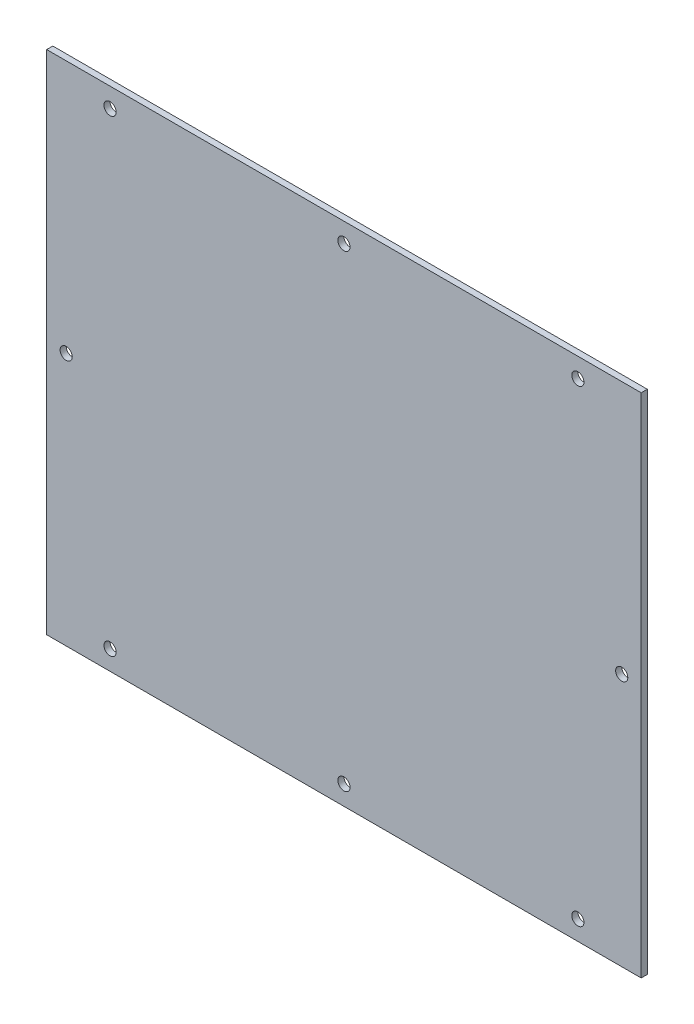
ISO-10303-21;
HEADER;
FILE_DESCRIPTION(('STEP AP214'),'2;1');
FILE_NAME('part.step','',(''),(''),'','','');
FILE_SCHEMA(('AUTOMOTIVE_DESIGN { 1 0 10303 214 1 1 1 1 }'));
ENDSEC;
DATA;
#1=APPLICATION_CONTEXT('core data for automotive mechanical design processes');
#2=APPLICATION_PROTOCOL_DEFINITION('international standard','automotive_design',2000,#1);
#3=PRODUCT_CONTEXT('',#1,'mechanical');
#4=PRODUCT('Part','Part','',(#3));
#5=PRODUCT_RELATED_PRODUCT_CATEGORY('part','',(#4));
#6=PRODUCT_DEFINITION_FORMATION('','',#4);
#7=PRODUCT_DEFINITION_CONTEXT('part definition',#1,'design');
#8=PRODUCT_DEFINITION('design','',#6,#7);
#9=PRODUCT_DEFINITION_SHAPE('','',#8);
#10=(LENGTH_UNIT() NAMED_UNIT(*) SI_UNIT(.MILLI.,.METRE.));
#11=(NAMED_UNIT(*) PLANE_ANGLE_UNIT() SI_UNIT($,.RADIAN.));
#12=(NAMED_UNIT(*) SI_UNIT($,.STERADIAN.) SOLID_ANGLE_UNIT());
#13=UNCERTAINTY_MEASURE_WITH_UNIT(LENGTH_MEASURE(1.E-05),#10,'distance_accuracy_value','');
#14=(GEOMETRIC_REPRESENTATION_CONTEXT(3) GLOBAL_UNCERTAINTY_ASSIGNED_CONTEXT((#13)) GLOBAL_UNIT_ASSIGNED_CONTEXT((#10,
#11,#12)) REPRESENTATION_CONTEXT('',''));
#15=CARTESIAN_POINT('',(0.,0.,0.));
#16=DIRECTION('',(0.,0.,1.));
#17=DIRECTION('',(1.,0.,0.));
#18=AXIS2_PLACEMENT_3D('',#15,#16,#17);
#19=CARTESIAN_POINT('',(0.,0.,3.9878));
#20=DIRECTION('',(0.,0.,-1.));
#21=DIRECTION('',(-1.,0.,0.));
#22=AXIS2_PLACEMENT_3D('',#19,#20,#21);
#23=PLANE('',#22);
#24=DIRECTION('',(0.,1.,0.));
#25=VECTOR('',#24,1.);
#26=CARTESIAN_POINT('',(193.675,-165.1,3.9878));
#27=LINE('',#26,#25);
#28=CARTESIAN_POINT('',(193.675,-165.1,3.9878));
#29=VERTEX_POINT('',#28);
#30=CARTESIAN_POINT('',(193.675,165.1,3.9878));
#31=VERTEX_POINT('',#30);
#32=EDGE_CURVE('E95',#29,#31,#27,.T.);
#33=ORIENTED_EDGE('',*,*,#32,.T.);
#34=DIRECTION('',(-1.,0.,0.));
#35=VECTOR('',#34,1.);
#36=CARTESIAN_POINT('',(-193.675,165.1,3.9878));
#37=LINE('',#36,#35);
#38=CARTESIAN_POINT('',(-193.675,165.1,3.9878));
#39=VERTEX_POINT('',#38);
#40=EDGE_CURVE('E90',#31,#39,#37,.T.);
#41=ORIENTED_EDGE('',*,*,#40,.T.);
#42=DIRECTION('',(0.,-1.,0.));
#43=VECTOR('',#42,1.);
#44=CARTESIAN_POINT('',(-193.675,-165.1,3.9878));
#45=LINE('',#44,#43);
#46=CARTESIAN_POINT('',(-193.675,-165.1,3.9878));
#47=VERTEX_POINT('',#46);
#48=EDGE_CURVE('E93',#39,#47,#45,.T.);
#49=ORIENTED_EDGE('',*,*,#48,.T.);
#50=DIRECTION('',(1.,0.,0.));
#51=VECTOR('',#50,1.);
#52=CARTESIAN_POINT('',(-193.675,-165.1,3.9878));
#53=LINE('',#52,#51);
#54=EDGE_CURVE('E60',#47,#29,#53,.T.);
#55=ORIENTED_EDGE('',*,*,#54,.T.);
#56=EDGE_LOOP('',(#33,#41,#49,#55));
#57=FACE_BOUND('',#56,.T.);
#58=CARTESIAN_POINT('',(-180.975,0.,3.9878));
#59=DIRECTION('',(0.,0.,1.));
#60=DIRECTION('',(1.,0.,0.));
#61=AXIS2_PLACEMENT_3D('',#58,#59,#60);
#62=CIRCLE('',#61,3.96874999999999);
#63=CARTESIAN_POINT('',(-177.00625,0.,3.9878));
#64=VERTEX_POINT('',#63);
#65=EDGE_CURVE('E110',#64,#64,#62,.T.);
#66=ORIENTED_EDGE('',*,*,#65,.F.);
#67=EDGE_LOOP('',(#66));
#68=FACE_BOUND('',#67,.T.);
#69=CARTESIAN_POINT('',(0.,152.4,3.9878));
#70=DIRECTION('',(0.,0.,1.));
#71=DIRECTION('',(1.,0.,0.));
#72=AXIS2_PLACEMENT_3D('',#69,#70,#71);
#73=CIRCLE('',#72,3.96875);
#74=CARTESIAN_POINT('',(3.96875,152.4,3.9878));
#75=VERTEX_POINT('',#74);
#76=EDGE_CURVE('E125',#75,#75,#73,.T.);
#77=ORIENTED_EDGE('',*,*,#76,.F.);
#78=EDGE_LOOP('',(#77));
#79=FACE_BOUND('',#78,.T.);
#80=CARTESIAN_POINT('',(152.4,152.4,3.9878));
#81=DIRECTION('',(0.,0.,1.));
#82=DIRECTION('',(1.,0.,0.));
#83=AXIS2_PLACEMENT_3D('',#80,#81,#82);
#84=CIRCLE('',#83,3.96874999999999);
#85=CARTESIAN_POINT('',(156.36875,152.4,3.9878));
#86=VERTEX_POINT('',#85);
#87=EDGE_CURVE('E131',#86,#86,#84,.T.);
#88=ORIENTED_EDGE('',*,*,#87,.F.);
#89=EDGE_LOOP('',(#88));
#90=FACE_BOUND('',#89,.T.);
#91=CARTESIAN_POINT('',(-152.4,152.399999999999,3.9878));
#92=DIRECTION('',(0.,0.,1.));
#93=DIRECTION('',(1.,0.,0.));
#94=AXIS2_PLACEMENT_3D('',#91,#92,#93);
#95=CIRCLE('',#94,3.96874999999999);
#96=CARTESIAN_POINT('',(-148.43125,152.399999999999,3.9878));
#97=VERTEX_POINT('',#96);
#98=EDGE_CURVE('E137',#97,#97,#95,.T.);
#99=ORIENTED_EDGE('',*,*,#98,.F.);
#100=EDGE_LOOP('',(#99));
#101=FACE_BOUND('',#100,.T.);
#102=CARTESIAN_POINT('',(180.975,0.,3.9878));
#103=DIRECTION('',(0.,0.,1.));
#104=DIRECTION('',(-1.,0.,0.));
#105=AXIS2_PLACEMENT_3D('',#102,#103,#104);
#106=CIRCLE('',#105,3.96874999999999);
#107=CARTESIAN_POINT('',(177.00625,0.,3.9878));
#108=VERTEX_POINT('',#107);
#109=EDGE_CURVE('E143',#108,#108,#106,.T.);
#110=ORIENTED_EDGE('',*,*,#109,.F.);
#111=EDGE_LOOP('',(#110));
#112=FACE_BOUND('',#111,.T.);
#113=CARTESIAN_POINT('',(152.4,-152.4,3.9878));
#114=DIRECTION('',(0.,0.,1.));
#115=DIRECTION('',(-1.,0.,0.));
#116=AXIS2_PLACEMENT_3D('',#113,#114,#115);
#117=CIRCLE('',#116,3.96874999999999);
#118=CARTESIAN_POINT('',(148.43125,-152.4,3.9878));
#119=VERTEX_POINT('',#118);
#120=EDGE_CURVE('E149',#119,#119,#117,.T.);
#121=ORIENTED_EDGE('',*,*,#120,.F.);
#122=EDGE_LOOP('',(#121));
#123=FACE_BOUND('',#122,.T.);
#124=CARTESIAN_POINT('',(0.,-152.4,3.9878));
#125=DIRECTION('',(0.,0.,1.));
#126=DIRECTION('',(-1.,0.,0.));
#127=AXIS2_PLACEMENT_3D('',#124,#125,#126);
#128=CIRCLE('',#127,3.96875);
#129=CARTESIAN_POINT('',(-3.96875,-152.4,3.9878));
#130=VERTEX_POINT('',#129);
#131=EDGE_CURVE('E155',#130,#130,#128,.T.);
#132=ORIENTED_EDGE('',*,*,#131,.F.);
#133=EDGE_LOOP('',(#132));
#134=FACE_BOUND('',#133,.T.);
#135=CARTESIAN_POINT('',(-152.4,-152.399999999999,3.9878));
#136=DIRECTION('',(0.,0.,1.));
#137=DIRECTION('',(-1.,0.,0.));
#138=AXIS2_PLACEMENT_3D('',#135,#136,#137);
#139=CIRCLE('',#138,3.96874999999999);
#140=CARTESIAN_POINT('',(-156.36875,-152.399999999999,3.9878));
#141=VERTEX_POINT('',#140);
#142=EDGE_CURVE('E161',#141,#141,#139,.T.);
#143=ORIENTED_EDGE('',*,*,#142,.F.);
#144=EDGE_LOOP('',(#143));
#145=FACE_BOUND('',#144,.T.);
#146=ADVANCED_FACE('F43',(#57,#68,#79,#90,#101,#112,#123,#134,#145),#23,.F.);
#147=CARTESIAN_POINT('',(0.,0.,0.));
#148=DIRECTION('',(0.,0.,-1.));
#149=DIRECTION('',(-1.,0.,0.));
#150=AXIS2_PLACEMENT_3D('',#147,#148,#149);
#151=PLANE('',#150);
#152=CARTESIAN_POINT('',(0.,-152.4,0.));
#153=DIRECTION('',(0.,0.,1.));
#154=DIRECTION('',(-1.,0.,0.));
#155=AXIS2_PLACEMENT_3D('',#152,#153,#154);
#156=CIRCLE('',#155,3.96875);
#157=CARTESIAN_POINT('',(-3.96875,-152.4,0.));
#158=VERTEX_POINT('',#157);
#159=EDGE_CURVE('E158',#158,#158,#156,.T.);
#160=ORIENTED_EDGE('',*,*,#159,.T.);
#161=EDGE_LOOP('',(#160));
#162=FACE_BOUND('',#161,.T.);
#163=CARTESIAN_POINT('',(180.975,0.,0.));
#164=DIRECTION('',(0.,0.,1.));
#165=DIRECTION('',(-1.,0.,0.));
#166=AXIS2_PLACEMENT_3D('',#163,#164,#165);
#167=CIRCLE('',#166,3.96874999999999);
#168=CARTESIAN_POINT('',(177.00625,0.,0.));
#169=VERTEX_POINT('',#168);
#170=EDGE_CURVE('E146',#169,#169,#167,.T.);
#171=ORIENTED_EDGE('',*,*,#170,.T.);
#172=EDGE_LOOP('',(#171));
#173=FACE_BOUND('',#172,.T.);
#174=CARTESIAN_POINT('',(152.4,152.4,0.));
#175=DIRECTION('',(0.,0.,1.));
#176=DIRECTION('',(1.,0.,0.));
#177=AXIS2_PLACEMENT_3D('',#174,#175,#176);
#178=CIRCLE('',#177,3.96874999999999);
#179=CARTESIAN_POINT('',(156.36875,152.4,0.));
#180=VERTEX_POINT('',#179);
#181=EDGE_CURVE('E134',#180,#180,#178,.T.);
#182=ORIENTED_EDGE('',*,*,#181,.T.);
#183=EDGE_LOOP('',(#182));
#184=FACE_BOUND('',#183,.T.);
#185=CARTESIAN_POINT('',(-180.975,0.,0.));
#186=DIRECTION('',(0.,0.,1.));
#187=DIRECTION('',(1.,0.,0.));
#188=AXIS2_PLACEMENT_3D('',#185,#186,#187);
#189=CIRCLE('',#188,3.96874999999999);
#190=CARTESIAN_POINT('',(-177.00625,0.,0.));
#191=VERTEX_POINT('',#190);
#192=EDGE_CURVE('E122',#191,#191,#189,.T.);
#193=ORIENTED_EDGE('',*,*,#192,.T.);
#194=EDGE_LOOP('',(#193));
#195=FACE_BOUND('',#194,.T.);
#196=DIRECTION('',(0.,1.,0.));
#197=VECTOR('',#196,1.);
#198=CARTESIAN_POINT('',(193.675,-165.1,0.));
#199=LINE('',#198,#197);
#200=CARTESIAN_POINT('',(193.675,-165.1,0.));
#201=VERTEX_POINT('',#200);
#202=CARTESIAN_POINT('',(193.675,165.1,0.));
#203=VERTEX_POINT('',#202);
#204=EDGE_CURVE('E107',#201,#203,#199,.T.);
#205=ORIENTED_EDGE('',*,*,#204,.F.);
#206=DIRECTION('',(1.,0.,0.));
#207=VECTOR('',#206,1.);
#208=CARTESIAN_POINT('',(-193.675,-165.1,0.));
#209=LINE('',#208,#207);
#210=CARTESIAN_POINT('',(-193.675,-165.1,0.));
#211=VERTEX_POINT('',#210);
#212=EDGE_CURVE('E83',#211,#201,#209,.T.);
#213=ORIENTED_EDGE('',*,*,#212,.F.);
#214=DIRECTION('',(0.,-1.,0.));
#215=VECTOR('',#214,1.);
#216=CARTESIAN_POINT('',(-193.675,-165.1,0.));
#217=LINE('',#216,#215);
#218=CARTESIAN_POINT('',(-193.675,165.1,0.));
#219=VERTEX_POINT('',#218);
#220=EDGE_CURVE('E77',#219,#211,#217,.T.);
#221=ORIENTED_EDGE('',*,*,#220,.F.);
#222=DIRECTION('',(-1.,0.,0.));
#223=VECTOR('',#222,1.);
#224=CARTESIAN_POINT('',(-193.675,165.1,0.));
#225=LINE('',#224,#223);
#226=EDGE_CURVE('E99',#203,#219,#225,.T.);
#227=ORIENTED_EDGE('',*,*,#226,.F.);
#228=EDGE_LOOP('',(#205,#213,#221,#227));
#229=FACE_BOUND('',#228,.T.);
#230=CARTESIAN_POINT('',(0.,152.4,0.));
#231=DIRECTION('',(0.,0.,1.));
#232=DIRECTION('',(1.,0.,0.));
#233=AXIS2_PLACEMENT_3D('',#230,#231,#232);
#234=CIRCLE('',#233,3.96875);
#235=CARTESIAN_POINT('',(3.96875,152.4,0.));
#236=VERTEX_POINT('',#235);
#237=EDGE_CURVE('E128',#236,#236,#234,.T.);
#238=ORIENTED_EDGE('',*,*,#237,.T.);
#239=EDGE_LOOP('',(#238));
#240=FACE_BOUND('',#239,.T.);
#241=CARTESIAN_POINT('',(-152.4,152.399999999999,0.));
#242=DIRECTION('',(0.,0.,1.));
#243=DIRECTION('',(1.,0.,0.));
#244=AXIS2_PLACEMENT_3D('',#241,#242,#243);
#245=CIRCLE('',#244,3.96874999999999);
#246=CARTESIAN_POINT('',(-148.43125,152.399999999999,0.));
#247=VERTEX_POINT('',#246);
#248=EDGE_CURVE('E140',#247,#247,#245,.T.);
#249=ORIENTED_EDGE('',*,*,#248,.T.);
#250=EDGE_LOOP('',(#249));
#251=FACE_BOUND('',#250,.T.);
#252=CARTESIAN_POINT('',(152.4,-152.4,0.));
#253=DIRECTION('',(0.,0.,1.));
#254=DIRECTION('',(-1.,0.,0.));
#255=AXIS2_PLACEMENT_3D('',#252,#253,#254);
#256=CIRCLE('',#255,3.96874999999999);
#257=CARTESIAN_POINT('',(148.43125,-152.4,0.));
#258=VERTEX_POINT('',#257);
#259=EDGE_CURVE('E152',#258,#258,#256,.T.);
#260=ORIENTED_EDGE('',*,*,#259,.T.);
#261=EDGE_LOOP('',(#260));
#262=FACE_BOUND('',#261,.T.);
#263=CARTESIAN_POINT('',(-152.4,-152.399999999999,0.));
#264=DIRECTION('',(0.,0.,1.));
#265=DIRECTION('',(-1.,0.,0.));
#266=AXIS2_PLACEMENT_3D('',#263,#264,#265);
#267=CIRCLE('',#266,3.96874999999999);
#268=CARTESIAN_POINT('',(-156.36875,-152.399999999999,0.));
#269=VERTEX_POINT('',#268);
#270=EDGE_CURVE('E164',#269,#269,#267,.T.);
#271=ORIENTED_EDGE('',*,*,#270,.T.);
#272=EDGE_LOOP('',(#271));
#273=FACE_BOUND('',#272,.T.);
#274=ADVANCED_FACE('F118',(#162,#173,#184,#195,#229,#240,#251,#262,#273),#151,.T.);
#275=CARTESIAN_POINT('',(193.675,-165.1,3.9878));
#276=DIRECTION('',(-1.,0.,0.));
#277=DIRECTION('',(0.,0.,1.));
#278=AXIS2_PLACEMENT_3D('',#275,#276,#277);
#279=PLANE('',#278);
#280=ORIENTED_EDGE('',*,*,#204,.T.);
#281=DIRECTION('',(0.,0.,-1.));
#282=VECTOR('',#281,1.);
#283=CARTESIAN_POINT('',(193.675,165.1,3.9878));
#284=LINE('',#283,#282);
#285=EDGE_CURVE('E11',#31,#203,#284,.T.);
#286=ORIENTED_EDGE('',*,*,#285,.F.);
#287=ORIENTED_EDGE('',*,*,#32,.F.);
#288=DIRECTION('',(0.,0.,-1.));
#289=VECTOR('',#288,1.);
#290=CARTESIAN_POINT('',(193.675,-165.1,3.9878));
#291=LINE('',#290,#289);
#292=EDGE_CURVE('E103',#29,#201,#291,.T.);
#293=ORIENTED_EDGE('',*,*,#292,.T.);
#294=EDGE_LOOP('',(#280,#286,#287,#293));
#295=FACE_BOUND('',#294,.T.);
#296=ADVANCED_FACE('F45',(#295),#279,.F.);
#297=CARTESIAN_POINT('',(-193.675,165.1,3.9878));
#298=DIRECTION('',(0.,-1.,0.));
#299=DIRECTION('',(0.,0.,-1.));
#300=AXIS2_PLACEMENT_3D('',#297,#298,#299);
#301=PLANE('',#300);
#302=ORIENTED_EDGE('',*,*,#226,.T.);
#303=DIRECTION('',(0.,0.,-1.));
#304=VECTOR('',#303,1.);
#305=CARTESIAN_POINT('',(-193.675,165.1,3.9878));
#306=LINE('',#305,#304);
#307=EDGE_CURVE('E52',#39,#219,#306,.T.);
#308=ORIENTED_EDGE('',*,*,#307,.F.);
#309=ORIENTED_EDGE('',*,*,#40,.F.);
#310=ORIENTED_EDGE('',*,*,#285,.T.);
#311=EDGE_LOOP('',(#302,#308,#309,#310));
#312=FACE_BOUND('',#311,.T.);
#313=ADVANCED_FACE('F98',(#312),#301,.F.);
#314=CARTESIAN_POINT('',(-193.675,-165.1,3.9878));
#315=DIRECTION('',(1.,0.,0.));
#316=DIRECTION('',(0.,0.,-1.));
#317=AXIS2_PLACEMENT_3D('',#314,#315,#316);
#318=PLANE('',#317);
#319=ORIENTED_EDGE('',*,*,#220,.T.);
#320=DIRECTION('',(0.,0.,-1.));
#321=VECTOR('',#320,1.);
#322=CARTESIAN_POINT('',(-193.675,-165.1,3.9878));
#323=LINE('',#322,#321);
#324=EDGE_CURVE('E100',#47,#211,#323,.T.);
#325=ORIENTED_EDGE('',*,*,#324,.F.);
#326=ORIENTED_EDGE('',*,*,#48,.F.);
#327=ORIENTED_EDGE('',*,*,#307,.T.);
#328=EDGE_LOOP('',(#319,#325,#326,#327));
#329=FACE_BOUND('',#328,.T.);
#330=ADVANCED_FACE('F101',(#329),#318,.F.);
#331=CARTESIAN_POINT('',(-193.675,-165.1,3.9878));
#332=DIRECTION('',(0.,1.,0.));
#333=DIRECTION('',(0.,0.,1.));
#334=AXIS2_PLACEMENT_3D('',#331,#332,#333);
#335=PLANE('',#334);
#336=ORIENTED_EDGE('',*,*,#212,.T.);
#337=ORIENTED_EDGE('',*,*,#292,.F.);
#338=ORIENTED_EDGE('',*,*,#54,.F.);
#339=ORIENTED_EDGE('',*,*,#324,.T.);
#340=EDGE_LOOP('',(#336,#337,#338,#339));
#341=FACE_BOUND('',#340,.T.);
#342=ADVANCED_FACE('F115',(#341),#335,.F.);
#343=CARTESIAN_POINT('',(-180.975,0.,3.9878));
#344=DIRECTION('',(0.,0.,-1.));
#345=DIRECTION('',(-1.,0.,0.));
#346=AXIS2_PLACEMENT_3D('',#343,#344,#345);
#347=CYLINDRICAL_SURFACE('',#346,3.96874999999999);
#348=ORIENTED_EDGE('',*,*,#65,.T.);
#349=EDGE_LOOP('',(#348));
#350=FACE_BOUND('',#349,.T.);
#351=ORIENTED_EDGE('',*,*,#192,.F.);
#352=EDGE_LOOP('',(#351));
#353=FACE_BOUND('',#352,.T.);
#354=ADVANCED_FACE('F181',(#350,#353),#347,.F.);
#355=CARTESIAN_POINT('',(0.,152.4,3.9878));
#356=DIRECTION('',(0.,0.,-1.));
#357=DIRECTION('',(-1.,0.,0.));
#358=AXIS2_PLACEMENT_3D('',#355,#356,#357);
#359=CYLINDRICAL_SURFACE('',#358,3.96875);
#360=ORIENTED_EDGE('',*,*,#76,.T.);
#361=EDGE_LOOP('',(#360));
#362=FACE_BOUND('',#361,.T.);
#363=ORIENTED_EDGE('',*,*,#237,.F.);
#364=EDGE_LOOP('',(#363));
#365=FACE_BOUND('',#364,.T.);
#366=ADVANCED_FACE('F216',(#362,#365),#359,.F.);
#367=CARTESIAN_POINT('',(152.4,152.4,3.9878));
#368=DIRECTION('',(0.,0.,-1.));
#369=DIRECTION('',(-1.,0.,0.));
#370=AXIS2_PLACEMENT_3D('',#367,#368,#369);
#371=CYLINDRICAL_SURFACE('',#370,3.96874999999999);
#372=ORIENTED_EDGE('',*,*,#87,.T.);
#373=EDGE_LOOP('',(#372));
#374=FACE_BOUND('',#373,.T.);
#375=ORIENTED_EDGE('',*,*,#181,.F.);
#376=EDGE_LOOP('',(#375));
#377=FACE_BOUND('',#376,.T.);
#378=ADVANCED_FACE('F223',(#374,#377),#371,.F.);
#379=CARTESIAN_POINT('',(-152.4,152.399999999999,3.9878));
#380=DIRECTION('',(0.,0.,-1.));
#381=DIRECTION('',(-1.,0.,0.));
#382=AXIS2_PLACEMENT_3D('',#379,#380,#381);
#383=CYLINDRICAL_SURFACE('',#382,3.96874999999999);
#384=ORIENTED_EDGE('',*,*,#98,.T.);
#385=EDGE_LOOP('',(#384));
#386=FACE_BOUND('',#385,.T.);
#387=ORIENTED_EDGE('',*,*,#248,.F.);
#388=EDGE_LOOP('',(#387));
#389=FACE_BOUND('',#388,.T.);
#390=ADVANCED_FACE('F230',(#386,#389),#383,.F.);
#391=CARTESIAN_POINT('',(180.975,0.,3.9878));
#392=DIRECTION('',(0.,0.,-1.));
#393=DIRECTION('',(-1.,0.,0.));
#394=AXIS2_PLACEMENT_3D('',#391,#392,#393);
#395=CYLINDRICAL_SURFACE('',#394,3.96874999999999);
#396=ORIENTED_EDGE('',*,*,#109,.T.);
#397=EDGE_LOOP('',(#396));
#398=FACE_BOUND('',#397,.T.);
#399=ORIENTED_EDGE('',*,*,#170,.F.);
#400=EDGE_LOOP('',(#399));
#401=FACE_BOUND('',#400,.T.);
#402=ADVANCED_FACE('F238',(#398,#401),#395,.F.);
#403=CARTESIAN_POINT('',(152.4,-152.4,3.9878));
#404=DIRECTION('',(0.,0.,-1.));
#405=DIRECTION('',(-1.,0.,0.));
#406=AXIS2_PLACEMENT_3D('',#403,#404,#405);
#407=CYLINDRICAL_SURFACE('',#406,3.96874999999999);
#408=ORIENTED_EDGE('',*,*,#120,.T.);
#409=EDGE_LOOP('',(#408));
#410=FACE_BOUND('',#409,.T.);
#411=ORIENTED_EDGE('',*,*,#259,.F.);
#412=EDGE_LOOP('',(#411));
#413=FACE_BOUND('',#412,.T.);
#414=ADVANCED_FACE('F246',(#410,#413),#407,.F.);
#415=CARTESIAN_POINT('',(0.,-152.4,3.9878));
#416=DIRECTION('',(0.,0.,-1.));
#417=DIRECTION('',(-1.,0.,0.));
#418=AXIS2_PLACEMENT_3D('',#415,#416,#417);
#419=CYLINDRICAL_SURFACE('',#418,3.96875);
#420=ORIENTED_EDGE('',*,*,#131,.T.);
#421=EDGE_LOOP('',(#420));
#422=FACE_BOUND('',#421,.T.);
#423=ORIENTED_EDGE('',*,*,#159,.F.);
#424=EDGE_LOOP('',(#423));
#425=FACE_BOUND('',#424,.T.);
#426=ADVANCED_FACE('F254',(#422,#425),#419,.F.);
#427=CARTESIAN_POINT('',(-152.4,-152.399999999999,3.9878));
#428=DIRECTION('',(0.,0.,-1.));
#429=DIRECTION('',(-1.,0.,0.));
#430=AXIS2_PLACEMENT_3D('',#427,#428,#429);
#431=CYLINDRICAL_SURFACE('',#430,3.96874999999999);
#432=ORIENTED_EDGE('',*,*,#142,.T.);
#433=EDGE_LOOP('',(#432));
#434=FACE_BOUND('',#433,.T.);
#435=ORIENTED_EDGE('',*,*,#270,.F.);
#436=EDGE_LOOP('',(#435));
#437=FACE_BOUND('',#436,.T.);
#438=ADVANCED_FACE('F170',(#434,#437),#431,.F.);
#439=CLOSED_SHELL('',(#146,#274,#296,#313,#330,#342,#354,#366,#378,#390,#402,#414,#426,#438));
#440=MANIFOLD_SOLID_BREP('B2',#439);
#441=ADVANCED_BREP_SHAPE_REPRESENTATION('',(#18,#440),#14);
#442=SHAPE_DEFINITION_REPRESENTATION(#9,#441);
ENDSEC;
END-ISO-10303-21;
